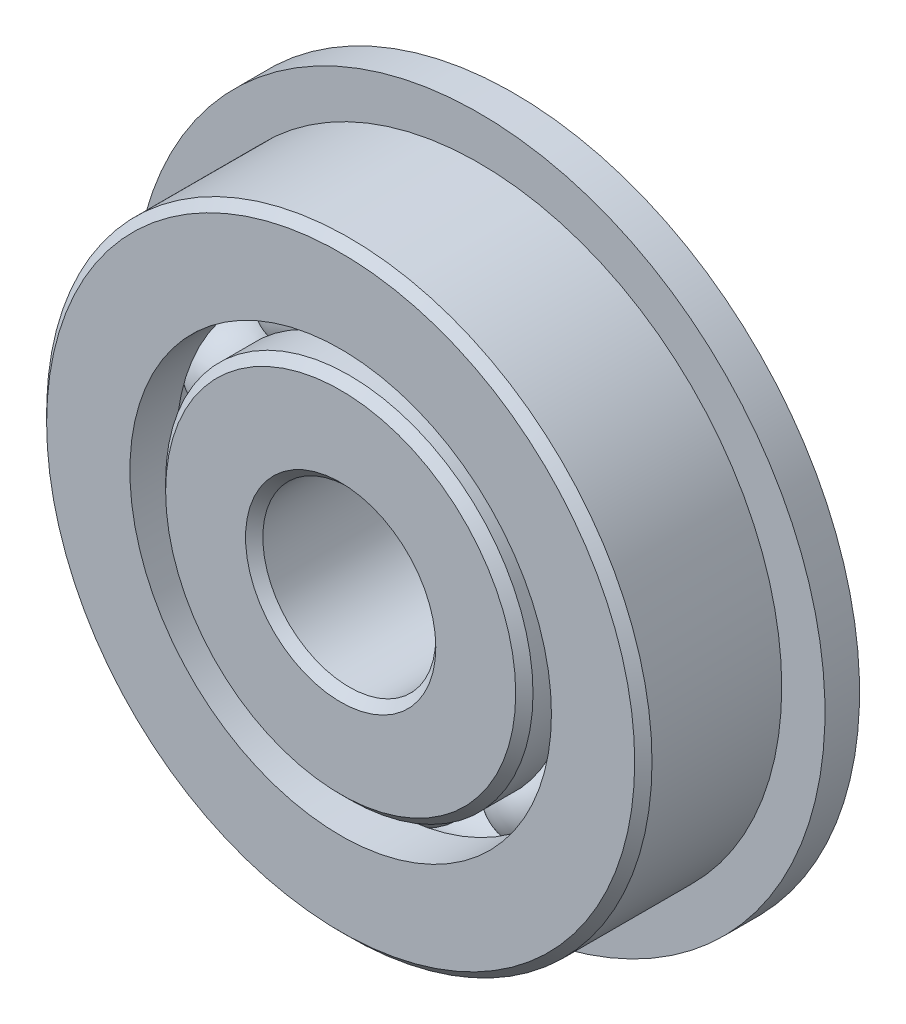
ISO-10303-21;
HEADER;
FILE_DESCRIPTION(('STEP AP214'),'2;1');
FILE_NAME('part.step','',(''),(''),'','','');
FILE_SCHEMA(('AUTOMOTIVE_DESIGN { 1 0 10303 214 1 1 1 1 }'));
ENDSEC;
DATA;
#1=APPLICATION_CONTEXT('core data for automotive mechanical design processes');
#2=APPLICATION_PROTOCOL_DEFINITION('international standard','automotive_design',2000,#1);
#3=PRODUCT_CONTEXT('',#1,'mechanical');
#4=PRODUCT('Part','Part','',(#3));
#5=PRODUCT_RELATED_PRODUCT_CATEGORY('part','',(#4));
#6=PRODUCT_DEFINITION_FORMATION('','',#4);
#7=PRODUCT_DEFINITION_CONTEXT('part definition',#1,'design');
#8=PRODUCT_DEFINITION('design','',#6,#7);
#9=PRODUCT_DEFINITION_SHAPE('','',#8);
#10=(LENGTH_UNIT() NAMED_UNIT(*) SI_UNIT(.MILLI.,.METRE.));
#11=(NAMED_UNIT(*) PLANE_ANGLE_UNIT() SI_UNIT($,.RADIAN.));
#12=(NAMED_UNIT(*) SI_UNIT($,.STERADIAN.) SOLID_ANGLE_UNIT());
#13=UNCERTAINTY_MEASURE_WITH_UNIT(LENGTH_MEASURE(1.E-05),#10,'distance_accuracy_value','');
#14=(GEOMETRIC_REPRESENTATION_CONTEXT(3) GLOBAL_UNCERTAINTY_ASSIGNED_CONTEXT((#13)) GLOBAL_UNIT_ASSIGNED_CONTEXT((#10,
#11,#12)) REPRESENTATION_CONTEXT('',''));
#15=CARTESIAN_POINT('',(0.,0.,0.));
#16=DIRECTION('',(0.,0.,1.));
#17=DIRECTION('',(1.,0.,0.));
#18=AXIS2_PLACEMENT_3D('',#15,#16,#17);
#19=CARTESIAN_POINT('',(-4.19899089606428,5.77941515356609,0.));
#20=DIRECTION('',(0.,0.,1.));
#21=DIRECTION('',(-0.587785252292462,0.809016994374955,0.));
#22=AXIS2_PLACEMENT_3D('',#19,#20,#21);
#23=SPHERICAL_SURFACE('',#22,1.5875);
#24=CARTESIAN_POINT('',(-4.19899089606428,5.77941515356609,1.5875));
#25=VERTEX_POINT('',#24);
#26=VERTEX_LOOP('',#25);
#27=FACE_BOUND('',#26,.T.);
#28=ADVANCED_FACE('F43',(#27),#23,.T.);
#29=CLOSED_SHELL('',(#28));
#30=MANIFOLD_SOLID_BREP('B2',#29);
#31=CARTESIAN_POINT('',(-6.79410998828348,2.20754015356611,0.));
#32=DIRECTION('',(0.,0.,1.));
#33=DIRECTION('',(-0.95105651629515,0.309016994374958,0.));
#34=AXIS2_PLACEMENT_3D('',#31,#32,#33);
#35=SPHERICAL_SURFACE('',#34,1.5875);
#36=CARTESIAN_POINT('',(-6.79410998828348,2.20754015356611,1.5875));
#37=VERTEX_POINT('',#36);
#38=VERTEX_LOOP('',#37);
#39=FACE_BOUND('',#38,.T.);
#40=ADVANCED_FACE('F64',(#39),#35,.T.);
#41=CLOSED_SHELL('',(#40));
#42=MANIFOLD_SOLID_BREP('B6',#41);
#43=CARTESIAN_POINT('',(-6.79410998828352,-2.20754015356597,0.));
#44=DIRECTION('',(0.,0.,1.));
#45=DIRECTION('',(-0.951056516295157,-0.309016994374938,0.));
#46=AXIS2_PLACEMENT_3D('',#43,#44,#45);
#47=SPHERICAL_SURFACE('',#46,1.5875);
#48=CARTESIAN_POINT('',(-6.79410998828352,-2.20754015356597,1.5875));
#49=VERTEX_POINT('',#48);
#50=VERTEX_LOOP('',#49);
#51=FACE_BOUND('',#50,.T.);
#52=ADVANCED_FACE('F85',(#51),#47,.T.);
#53=CLOSED_SHELL('',(#52));
#54=MANIFOLD_SOLID_BREP('B39',#53);
#55=CARTESIAN_POINT('',(-4.19899089606441,-5.77941515356599,0.));
#56=DIRECTION('',(0.,0.,1.));
#57=DIRECTION('',(-0.58778525229248,-0.809016994374942,0.));
#58=AXIS2_PLACEMENT_3D('',#55,#56,#57);
#59=SPHERICAL_SURFACE('',#58,1.5875);
#60=CARTESIAN_POINT('',(-4.19899089606441,-5.77941515356599,1.5875));
#61=VERTEX_POINT('',#60);
#62=VERTEX_LOOP('',#61);
#63=FACE_BOUND('',#62,.T.);
#64=ADVANCED_FACE('F106',(#63),#59,.T.);
#65=CLOSED_SHELL('',(#64));
#66=MANIFOLD_SOLID_BREP('B60',#65);
#67=CARTESIAN_POINT('',(0.,-7.14375,0.));
#68=DIRECTION('',(0.,0.,1.));
#69=DIRECTION('',(0.,-1.,0.));
#70=AXIS2_PLACEMENT_3D('',#67,#68,#69);
#71=SPHERICAL_SURFACE('',#70,1.5875);
#72=CARTESIAN_POINT('',(0.,-7.14375,1.5875));
#73=VERTEX_POINT('',#72);
#74=VERTEX_LOOP('',#73);
#75=FACE_BOUND('',#74,.T.);
#76=ADVANCED_FACE('F127',(#75),#71,.T.);
#77=CLOSED_SHELL('',(#76));
#78=MANIFOLD_SOLID_BREP('B81',#77);
#79=CARTESIAN_POINT('',(4.19899089606432,-5.77941515356606,0.));
#80=DIRECTION('',(0.,0.,1.));
#81=DIRECTION('',(0.587785252292469,-0.809016994374951,0.));
#82=AXIS2_PLACEMENT_3D('',#79,#80,#81);
#83=SPHERICAL_SURFACE('',#82,1.5875);
#84=CARTESIAN_POINT('',(4.19899089606432,-5.77941515356606,1.5875));
#85=VERTEX_POINT('',#84);
#86=VERTEX_LOOP('',#85);
#87=FACE_BOUND('',#86,.T.);
#88=ADVANCED_FACE('F147',(#87),#83,.T.);
#89=CLOSED_SHELL('',(#88));
#90=MANIFOLD_SOLID_BREP('B102',#89);
#91=CARTESIAN_POINT('',(6.7941099882835,-2.20754015356606,0.));
#92=DIRECTION('',(0.,0.,1.));
#93=DIRECTION('',(0.951056516295152,-0.309016994374952,0.));
#94=AXIS2_PLACEMENT_3D('',#91,#92,#93);
#95=SPHERICAL_SURFACE('',#94,1.5875);
#96=CARTESIAN_POINT('',(6.7941099882835,-2.20754015356606,1.5875));
#97=VERTEX_POINT('',#96);
#98=VERTEX_LOOP('',#97);
#99=FACE_BOUND('',#98,.T.);
#100=ADVANCED_FACE('F168',(#99),#95,.T.);
#101=CLOSED_SHELL('',(#100));
#102=MANIFOLD_SOLID_BREP('B123',#101);
#103=CARTESIAN_POINT('',(6.79410998828351,2.20754015356601,0.));
#104=DIRECTION('',(0.,0.,1.));
#105=DIRECTION('',(0.951056516295155,0.309016994374945,0.));
#106=AXIS2_PLACEMENT_3D('',#103,#104,#105);
#107=SPHERICAL_SURFACE('',#106,1.5875);
#108=CARTESIAN_POINT('',(6.79410998828351,2.20754015356601,1.5875));
#109=VERTEX_POINT('',#108);
#110=VERTEX_LOOP('',#109);
#111=FACE_BOUND('',#110,.T.);
#112=ADVANCED_FACE('F188',(#111),#107,.T.);
#113=CLOSED_SHELL('',(#112));
#114=MANIFOLD_SOLID_BREP('B143',#113);
#115=CARTESIAN_POINT('',(4.19899089606436,5.77941515356603,0.));
#116=DIRECTION('',(0.,0.,1.));
#117=DIRECTION('',(0.587785252292474,0.809016994374947,0.));
#118=AXIS2_PLACEMENT_3D('',#115,#116,#117);
#119=SPHERICAL_SURFACE('',#118,1.5875);
#120=CARTESIAN_POINT('',(4.19899089606436,5.77941515356603,1.5875));
#121=VERTEX_POINT('',#120);
#122=VERTEX_LOOP('',#121);
#123=FACE_BOUND('',#122,.T.);
#124=ADVANCED_FACE('F209',(#123),#119,.T.);
#125=CLOSED_SHELL('',(#124));
#126=MANIFOLD_SOLID_BREP('B164',#125);
#127=CARTESIAN_POINT('',(0.,7.14375,0.));
#128=DIRECTION('',(0.,0.,1.));
#129=DIRECTION('',(0.,1.,0.));
#130=AXIS2_PLACEMENT_3D('',#127,#128,#129);
#131=SPHERICAL_SURFACE('',#130,1.5875);
#132=CARTESIAN_POINT('',(0.,7.14375,1.5875));
#133=VERTEX_POINT('',#132);
#134=VERTEX_LOOP('',#133);
#135=FACE_BOUND('',#134,.T.);
#136=ADVANCED_FACE('F232',(#135),#131,.T.);
#137=CLOSED_SHELL('',(#136));
#138=MANIFOLD_SOLID_BREP('B184',#137);
#139=CARTESIAN_POINT('',(0.,0.,2.8575));
#140=DIRECTION('',(0.,0.,-1.));
#141=DIRECTION('',(-1.,0.,0.));
#142=AXIS2_PLACEMENT_3D('',#139,#140,#141);
#143=CONICAL_SURFACE('',#142,6.7437,0.785398163397446);
#144=CARTESIAN_POINT('',(0.,0.,3.175));
#145=DIRECTION('',(0.,0.,1.));
#146=DIRECTION('',(1.,0.,0.));
#147=AXIS2_PLACEMENT_3D('',#144,#145,#146);
#148=CIRCLE('',#147,6.4262);
#149=CARTESIAN_POINT('',(6.4262,0.,3.175));
#150=VERTEX_POINT('',#149);
#151=EDGE_CURVE('E231',#150,#150,#148,.T.);
#152=ORIENTED_EDGE('',*,*,#151,.F.);
#153=EDGE_LOOP('',(#152));
#154=FACE_BOUND('',#153,.T.);
#155=CARTESIAN_POINT('',(0.,0.,2.8575));
#156=DIRECTION('',(0.,0.,1.));
#157=DIRECTION('',(1.,0.,0.));
#158=AXIS2_PLACEMENT_3D('',#155,#156,#157);
#159=CIRCLE('',#158,6.7437);
#160=CARTESIAN_POINT('',(6.7437,0.,2.8575));
#161=VERTEX_POINT('',#160);
#162=EDGE_CURVE('E301',#161,#161,#159,.T.);
#163=ORIENTED_EDGE('',*,*,#162,.T.);
#164=EDGE_LOOP('',(#163));
#165=FACE_BOUND('',#164,.T.);
#166=ADVANCED_FACE('F252',(#154,#165),#143,.T.);
#167=CARTESIAN_POINT('',(0.,3.4925,3.175));
#168=DIRECTION('',(0.,0.,-1.));
#169=DIRECTION('',(-1.,0.,0.));
#170=AXIS2_PLACEMENT_3D('',#167,#168,#169);
#171=PLANE('',#170);
#172=CARTESIAN_POINT('',(0.,0.,3.175));
#173=DIRECTION('',(0.,0.,1.));
#174=DIRECTION('',(1.,0.,0.));
#175=AXIS2_PLACEMENT_3D('',#172,#173,#174);
#176=CIRCLE('',#175,3.4925);
#177=CARTESIAN_POINT('',(3.4925,0.,3.175));
#178=VERTEX_POINT('',#177);
#179=EDGE_CURVE('E259',#178,#178,#176,.T.);
#180=ORIENTED_EDGE('',*,*,#179,.F.);
#181=EDGE_LOOP('',(#180));
#182=FACE_BOUND('',#181,.T.);
#183=ORIENTED_EDGE('',*,*,#151,.T.);
#184=EDGE_LOOP('',(#183));
#185=FACE_BOUND('',#184,.T.);
#186=ADVANCED_FACE('F350',(#182,#185),#171,.F.);
#187=CARTESIAN_POINT('',(0.,0.,3.175));
#188=DIRECTION('',(0.,0.,1.));
#189=DIRECTION('',(1.,0.,0.));
#190=AXIS2_PLACEMENT_3D('',#187,#188,#189);
#191=CONICAL_SURFACE('',#190,3.4925,0.785398163397448);
#192=CARTESIAN_POINT('',(0.,0.,2.8575));
#193=DIRECTION('',(0.,0.,1.));
#194=DIRECTION('',(1.,0.,0.));
#195=AXIS2_PLACEMENT_3D('',#192,#193,#194);
#196=CIRCLE('',#195,3.175);
#197=CARTESIAN_POINT('',(3.175,0.,2.8575));
#198=VERTEX_POINT('',#197);
#199=EDGE_CURVE('E266',#198,#198,#196,.T.);
#200=ORIENTED_EDGE('',*,*,#199,.F.);
#201=EDGE_LOOP('',(#200));
#202=FACE_BOUND('',#201,.T.);
#203=ORIENTED_EDGE('',*,*,#179,.T.);
#204=EDGE_LOOP('',(#203));
#205=FACE_BOUND('',#204,.T.);
#206=ADVANCED_FACE('F345',(#202,#205),#191,.F.);
#207=CARTESIAN_POINT('',(0.,0.,3.175));
#208=DIRECTION('',(0.,0.,1.));
#209=DIRECTION('',(1.,0.,0.));
#210=AXIS2_PLACEMENT_3D('',#207,#208,#209);
#211=CYLINDRICAL_SURFACE('',#210,3.175);
#212=CARTESIAN_POINT('',(0.,0.,-4.4577));
#213=DIRECTION('',(0.,0.,1.));
#214=DIRECTION('',(1.,0.,0.));
#215=AXIS2_PLACEMENT_3D('',#212,#213,#214);
#216=CIRCLE('',#215,3.175);
#217=CARTESIAN_POINT('',(3.175,0.,-4.4577));
#218=VERTEX_POINT('',#217);
#219=EDGE_CURVE('E275',#218,#218,#216,.T.);
#220=ORIENTED_EDGE('',*,*,#219,.F.);
#221=EDGE_LOOP('',(#220));
#222=FACE_BOUND('',#221,.T.);
#223=ORIENTED_EDGE('',*,*,#199,.T.);
#224=EDGE_LOOP('',(#223));
#225=FACE_BOUND('',#224,.T.);
#226=ADVANCED_FACE('F339',(#222,#225),#211,.F.);
#227=CARTESIAN_POINT('',(0.,0.,-4.4577));
#228=DIRECTION('',(0.,0.,-1.));
#229=DIRECTION('',(-1.,0.,0.));
#230=AXIS2_PLACEMENT_3D('',#227,#228,#229);
#231=CONICAL_SURFACE('',#230,3.175,0.78539816339745);
#232=CARTESIAN_POINT('',(0.,0.,-4.7752));
#233=DIRECTION('',(0.,0.,1.));
#234=DIRECTION('',(1.,0.,0.));
#235=AXIS2_PLACEMENT_3D('',#232,#233,#234);
#236=CIRCLE('',#235,3.4925);
#237=CARTESIAN_POINT('',(3.4925,0.,-4.7752));
#238=VERTEX_POINT('',#237);
#239=EDGE_CURVE('E281',#238,#238,#236,.T.);
#240=ORIENTED_EDGE('',*,*,#239,.F.);
#241=EDGE_LOOP('',(#240));
#242=FACE_BOUND('',#241,.T.);
#243=ORIENTED_EDGE('',*,*,#219,.T.);
#244=EDGE_LOOP('',(#243));
#245=FACE_BOUND('',#244,.T.);
#246=ADVANCED_FACE('F333',(#242,#245),#231,.F.);
#247=CARTESIAN_POINT('',(0.,6.4262,-4.7752));
#248=DIRECTION('',(0.,0.,1.));
#249=DIRECTION('',(1.,0.,0.));
#250=AXIS2_PLACEMENT_3D('',#247,#248,#249);
#251=PLANE('',#250);
#252=CARTESIAN_POINT('',(0.,0.,-4.7752));
#253=DIRECTION('',(0.,0.,1.));
#254=DIRECTION('',(1.,0.,0.));
#255=AXIS2_PLACEMENT_3D('',#252,#253,#254);
#256=CIRCLE('',#255,6.4262);
#257=CARTESIAN_POINT('',(6.4262,0.,-4.7752));
#258=VERTEX_POINT('',#257);
#259=EDGE_CURVE('E285',#258,#258,#256,.T.);
#260=ORIENTED_EDGE('',*,*,#259,.F.);
#261=EDGE_LOOP('',(#260));
#262=FACE_BOUND('',#261,.T.);
#263=ORIENTED_EDGE('',*,*,#239,.T.);
#264=EDGE_LOOP('',(#263));
#265=FACE_BOUND('',#264,.T.);
#266=ADVANCED_FACE('F327',(#262,#265),#251,.F.);
#267=CARTESIAN_POINT('',(0.,0.,-4.7752));
#268=DIRECTION('',(0.,0.,1.));
#269=DIRECTION('',(1.,0.,0.));
#270=AXIS2_PLACEMENT_3D('',#267,#268,#269);
#271=CONICAL_SURFACE('',#270,6.4262,0.785398163397447);
#272=CARTESIAN_POINT('',(0.,0.,-4.4577));
#273=DIRECTION('',(0.,0.,1.));
#274=DIRECTION('',(1.,0.,0.));
#275=AXIS2_PLACEMENT_3D('',#272,#273,#274);
#276=CIRCLE('',#275,6.7437);
#277=CARTESIAN_POINT('',(6.7437,0.,-4.4577));
#278=VERTEX_POINT('',#277);
#279=EDGE_CURVE('E289',#278,#278,#276,.T.);
#280=ORIENTED_EDGE('',*,*,#279,.F.);
#281=EDGE_LOOP('',(#280));
#282=FACE_BOUND('',#281,.T.);
#283=ORIENTED_EDGE('',*,*,#259,.T.);
#284=EDGE_LOOP('',(#283));
#285=FACE_BOUND('',#284,.T.);
#286=ADVANCED_FACE('F321',(#282,#285),#271,.T.);
#287=CARTESIAN_POINT('',(0.,0.,3.175));
#288=DIRECTION('',(0.,0.,1.));
#289=DIRECTION('',(1.,0.,0.));
#290=AXIS2_PLACEMENT_3D('',#287,#288,#289);
#291=CYLINDRICAL_SURFACE('',#290,6.7437);
#292=CARTESIAN_POINT('',(0.,0.,-1.53626698444639));
#293=DIRECTION('',(0.,0.,1.));
#294=DIRECTION('',(1.,0.,0.));
#295=AXIS2_PLACEMENT_3D('',#292,#293,#294);
#296=CIRCLE('',#295,6.7437);
#297=CARTESIAN_POINT('',(6.7437,0.,-1.53626698444639));
#298=VERTEX_POINT('',#297);
#299=EDGE_CURVE('E293',#298,#298,#296,.T.);
#300=ORIENTED_EDGE('',*,*,#299,.F.);
#301=EDGE_LOOP('',(#300));
#302=FACE_BOUND('',#301,.T.);
#303=ORIENTED_EDGE('',*,*,#279,.T.);
#304=EDGE_LOOP('',(#303));
#305=FACE_BOUND('',#304,.T.);
#306=ADVANCED_FACE('F315',(#302,#305),#291,.T.);
#307=CARTESIAN_POINT('',(0.,0.,0.));
#308=DIRECTION('',(0.,0.,1.));
#309=DIRECTION('',(1.,0.,0.));
#310=AXIS2_PLACEMENT_3D('',#307,#308,#309);
#311=TOROIDAL_SURFACE('',#310,7.14375,1.5875);
#312=CARTESIAN_POINT('',(0.,0.,1.53626698444639));
#313=DIRECTION('',(0.,0.,1.));
#314=DIRECTION('',(1.,0.,0.));
#315=AXIS2_PLACEMENT_3D('',#312,#313,#314);
#316=CIRCLE('',#315,6.7437);
#317=CARTESIAN_POINT('',(6.7437,0.,1.53626698444639));
#318=VERTEX_POINT('',#317);
#319=EDGE_CURVE('E297',#318,#318,#316,.T.);
#320=ORIENTED_EDGE('',*,*,#319,.F.);
#321=EDGE_LOOP('',(#320));
#322=FACE_BOUND('',#321,.T.);
#323=ORIENTED_EDGE('',*,*,#299,.T.);
#324=EDGE_LOOP('',(#323));
#325=FACE_BOUND('',#324,.T.);
#326=ADVANCED_FACE('F309',(#322,#325),#311,.F.);
#327=CARTESIAN_POINT('',(0.,0.,3.175));
#328=DIRECTION('',(0.,0.,1.));
#329=DIRECTION('',(1.,0.,0.));
#330=AXIS2_PLACEMENT_3D('',#327,#328,#329);
#331=CYLINDRICAL_SURFACE('',#330,6.7437);
#332=ORIENTED_EDGE('',*,*,#162,.F.);
#333=EDGE_LOOP('',(#332));
#334=FACE_BOUND('',#333,.T.);
#335=ORIENTED_EDGE('',*,*,#319,.T.);
#336=EDGE_LOOP('',(#335));
#337=FACE_BOUND('',#336,.T.);
#338=ADVANCED_FACE('F306',(#334,#337),#331,.T.);
#339=CLOSED_SHELL('',(#166,#186,#206,#226,#246,#266,#286,#306,#326,#338));
#340=MANIFOLD_SOLID_BREP('B205',#339);
#341=CARTESIAN_POINT('',(0.,0.,2.8575));
#342=DIRECTION('',(0.,0.,-1.));
#343=DIRECTION('',(-1.,0.,0.));
#344=AXIS2_PLACEMENT_3D('',#341,#342,#343);
#345=CONICAL_SURFACE('',#344,11.1125,0.785398163397446);
#346=CARTESIAN_POINT('',(0.,0.,3.175));
#347=DIRECTION('',(0.,0.,1.));
#348=DIRECTION('',(1.,0.,0.));
#349=AXIS2_PLACEMENT_3D('',#346,#347,#348);
#350=CIRCLE('',#349,10.795);
#351=CARTESIAN_POINT('',(10.795,0.,3.175));
#352=VERTEX_POINT('',#351);
#353=EDGE_CURVE('E476',#352,#352,#350,.T.);
#354=ORIENTED_EDGE('',*,*,#353,.F.);
#355=EDGE_LOOP('',(#354));
#356=FACE_BOUND('',#355,.T.);
#357=CARTESIAN_POINT('',(0.,0.,2.8575));
#358=DIRECTION('',(0.,0.,1.));
#359=DIRECTION('',(1.,0.,0.));
#360=AXIS2_PLACEMENT_3D('',#357,#358,#359);
#361=CIRCLE('',#360,11.1125);
#362=CARTESIAN_POINT('',(11.1125,0.,2.8575));
#363=VERTEX_POINT('',#362);
#364=EDGE_CURVE('E251',#363,#363,#361,.T.);
#365=ORIENTED_EDGE('',*,*,#364,.T.);
#366=EDGE_LOOP('',(#365));
#367=FACE_BOUND('',#366,.T.);
#368=ADVANCED_FACE('F444',(#356,#367),#345,.T.);
#369=CARTESIAN_POINT('',(0.,0.,3.175));
#370=DIRECTION('',(0.,0.,1.));
#371=DIRECTION('',(1.,0.,0.));
#372=AXIS2_PLACEMENT_3D('',#369,#370,#371);
#373=CYLINDRICAL_SURFACE('',#372,11.1125);
#374=CARTESIAN_POINT('',(0.,0.,-1.905));
#375=DIRECTION('',(0.,0.,1.));
#376=DIRECTION('',(1.,0.,0.));
#377=AXIS2_PLACEMENT_3D('',#374,#375,#376);
#378=CIRCLE('',#377,11.1125);
#379=CARTESIAN_POINT('',(11.1125,0.,-1.905));
#380=VERTEX_POINT('',#379);
#381=EDGE_CURVE('E480',#380,#380,#378,.T.);
#382=ORIENTED_EDGE('',*,*,#381,.T.);
#383=EDGE_LOOP('',(#382));
#384=FACE_BOUND('',#383,.T.);
#385=ORIENTED_EDGE('',*,*,#364,.F.);
#386=EDGE_LOOP('',(#385));
#387=FACE_BOUND('',#386,.T.);
#388=ADVANCED_FACE('F504',(#384,#387),#373,.T.);
#389=CARTESIAN_POINT('',(0.,10.795,-3.175));
#390=DIRECTION('',(0.,0.,1.));
#391=DIRECTION('',(1.,0.,0.));
#392=AXIS2_PLACEMENT_3D('',#389,#390,#391);
#393=PLANE('',#392);
#394=CARTESIAN_POINT('',(0.,0.,-3.175));
#395=DIRECTION('',(0.,0.,1.));
#396=DIRECTION('',(1.,0.,0.));
#397=AXIS2_PLACEMENT_3D('',#394,#395,#396);
#398=CIRCLE('',#397,7.737475);
#399=CARTESIAN_POINT('',(7.737475,0.,-3.175));
#400=VERTEX_POINT('',#399);
#401=EDGE_CURVE('E451',#400,#400,#398,.T.);
#402=ORIENTED_EDGE('',*,*,#401,.T.);
#403=EDGE_LOOP('',(#402));
#404=FACE_BOUND('',#403,.T.);
#405=CARTESIAN_POINT('',(0.,0.,-3.175));
#406=DIRECTION('',(0.,0.,-1.));
#407=DIRECTION('',(-1.,0.,0.));
#408=AXIS2_PLACEMENT_3D('',#405,#406,#407);
#409=CIRCLE('',#408,12.7);
#410=CARTESIAN_POINT('',(-12.7,0.,-3.175));
#411=VERTEX_POINT('',#410);
#412=EDGE_CURVE('E483',#411,#411,#409,.T.);
#413=ORIENTED_EDGE('',*,*,#412,.T.);
#414=EDGE_LOOP('',(#413));
#415=FACE_BOUND('',#414,.T.);
#416=ADVANCED_FACE('F507',(#404,#415),#393,.F.);
#417=CARTESIAN_POINT('',(0.,0.,3.175));
#418=DIRECTION('',(0.,0.,1.));
#419=DIRECTION('',(1.,0.,0.));
#420=AXIS2_PLACEMENT_3D('',#417,#418,#419);
#421=CYLINDRICAL_SURFACE('',#420,7.737475);
#422=CARTESIAN_POINT('',(0.,0.,-1.47229306674147));
#423=DIRECTION('',(0.,0.,1.));
#424=DIRECTION('',(1.,0.,0.));
#425=AXIS2_PLACEMENT_3D('',#422,#423,#424);
#426=CIRCLE('',#425,7.737475);
#427=CARTESIAN_POINT('',(7.737475,0.,-1.47229306674147));
#428=VERTEX_POINT('',#427);
#429=EDGE_CURVE('E460',#428,#428,#426,.T.);
#430=ORIENTED_EDGE('',*,*,#429,.T.);
#431=EDGE_LOOP('',(#430));
#432=FACE_BOUND('',#431,.T.);
#433=ORIENTED_EDGE('',*,*,#401,.F.);
#434=EDGE_LOOP('',(#433));
#435=FACE_BOUND('',#434,.T.);
#436=ADVANCED_FACE('F512',(#432,#435),#421,.F.);
#437=CARTESIAN_POINT('',(0.,0.,0.));
#438=DIRECTION('',(0.,0.,1.));
#439=DIRECTION('',(1.,0.,0.));
#440=AXIS2_PLACEMENT_3D('',#437,#438,#439);
#441=TOROIDAL_SURFACE('',#440,7.14375,1.5875);
#442=ORIENTED_EDGE('',*,*,#429,.F.);
#443=EDGE_LOOP('',(#442));
#444=FACE_BOUND('',#443,.T.);
#445=CARTESIAN_POINT('',(0.,0.,1.47229306674147));
#446=DIRECTION('',(0.,0.,1.));
#447=DIRECTION('',(1.,0.,0.));
#448=AXIS2_PLACEMENT_3D('',#445,#446,#447);
#449=CIRCLE('',#448,7.737475);
#450=CARTESIAN_POINT('',(7.737475,0.,1.47229306674147));
#451=VERTEX_POINT('',#450);
#452=EDGE_CURVE('E466',#451,#451,#449,.T.);
#453=ORIENTED_EDGE('',*,*,#452,.T.);
#454=EDGE_LOOP('',(#453));
#455=FACE_BOUND('',#454,.T.);
#456=ADVANCED_FACE('F518',(#444,#455),#441,.F.);
#457=CARTESIAN_POINT('',(0.,0.,3.175));
#458=DIRECTION('',(0.,0.,1.));
#459=DIRECTION('',(1.,0.,0.));
#460=AXIS2_PLACEMENT_3D('',#457,#458,#459);
#461=CYLINDRICAL_SURFACE('',#460,7.737475);
#462=ORIENTED_EDGE('',*,*,#452,.F.);
#463=EDGE_LOOP('',(#462));
#464=FACE_BOUND('',#463,.T.);
#465=CARTESIAN_POINT('',(0.,0.,3.175));
#466=DIRECTION('',(0.,0.,1.));
#467=DIRECTION('',(1.,0.,0.));
#468=AXIS2_PLACEMENT_3D('',#465,#466,#467);
#469=CIRCLE('',#468,7.737475);
#470=CARTESIAN_POINT('',(7.737475,0.,3.175));
#471=VERTEX_POINT('',#470);
#472=EDGE_CURVE('E472',#471,#471,#469,.T.);
#473=ORIENTED_EDGE('',*,*,#472,.T.);
#474=EDGE_LOOP('',(#473));
#475=FACE_BOUND('',#474,.T.);
#476=ADVANCED_FACE('F522',(#464,#475),#461,.F.);
#477=CARTESIAN_POINT('',(0.,10.795,3.175));
#478=DIRECTION('',(0.,0.,-1.));
#479=DIRECTION('',(-1.,0.,0.));
#480=AXIS2_PLACEMENT_3D('',#477,#478,#479);
#481=PLANE('',#480);
#482=ORIENTED_EDGE('',*,*,#472,.F.);
#483=EDGE_LOOP('',(#482));
#484=FACE_BOUND('',#483,.T.);
#485=ORIENTED_EDGE('',*,*,#353,.T.);
#486=EDGE_LOOP('',(#485));
#487=FACE_BOUND('',#486,.T.);
#488=ADVANCED_FACE('F500',(#484,#487),#481,.F.);
#489=CARTESIAN_POINT('',(0.,7.737475,-1.905));
#490=DIRECTION('',(0.,0.,1.));
#491=DIRECTION('',(1.,0.,0.));
#492=AXIS2_PLACEMENT_3D('',#489,#490,#491);
#493=PLANE('',#492);
#494=CARTESIAN_POINT('',(0.,0.,-1.905));
#495=DIRECTION('',(0.,0.,-1.));
#496=DIRECTION('',(-1.,0.,0.));
#497=AXIS2_PLACEMENT_3D('',#494,#495,#496);
#498=CIRCLE('',#497,12.7);
#499=CARTESIAN_POINT('',(-12.7,0.,-1.905));
#500=VERTEX_POINT('',#499);
#501=EDGE_CURVE('E486',#500,#500,#498,.T.);
#502=ORIENTED_EDGE('',*,*,#501,.F.);
#503=EDGE_LOOP('',(#502));
#504=FACE_BOUND('',#503,.T.);
#505=ORIENTED_EDGE('',*,*,#381,.F.);
#506=EDGE_LOOP('',(#505));
#507=FACE_BOUND('',#506,.T.);
#508=ADVANCED_FACE('F497',(#504,#507),#493,.T.);
#509=CARTESIAN_POINT('',(0.,0.,-3.175));
#510=DIRECTION('',(0.,0.,-1.));
#511=DIRECTION('',(-1.,0.,0.));
#512=AXIS2_PLACEMENT_3D('',#509,#510,#511);
#513=CYLINDRICAL_SURFACE('',#512,12.7);
#514=ORIENTED_EDGE('',*,*,#501,.T.);
#515=EDGE_LOOP('',(#514));
#516=FACE_BOUND('',#515,.T.);
#517=ORIENTED_EDGE('',*,*,#412,.F.);
#518=EDGE_LOOP('',(#517));
#519=FACE_BOUND('',#518,.T.);
#520=ADVANCED_FACE('F494',(#516,#519),#513,.T.);
#521=CLOSED_SHELL('',(#368,#388,#416,#436,#456,#476,#488,#508,#520));
#522=MANIFOLD_SOLID_BREP('B226',#521);
#523=ADVANCED_BREP_SHAPE_REPRESENTATION('',(#18,#30,#42,#54,#66,#78,#90,#102,#114,#126,#138,
#340,#522),#14);
#524=SHAPE_DEFINITION_REPRESENTATION(#9,#523);
ENDSEC;
END-ISO-10303-21;
